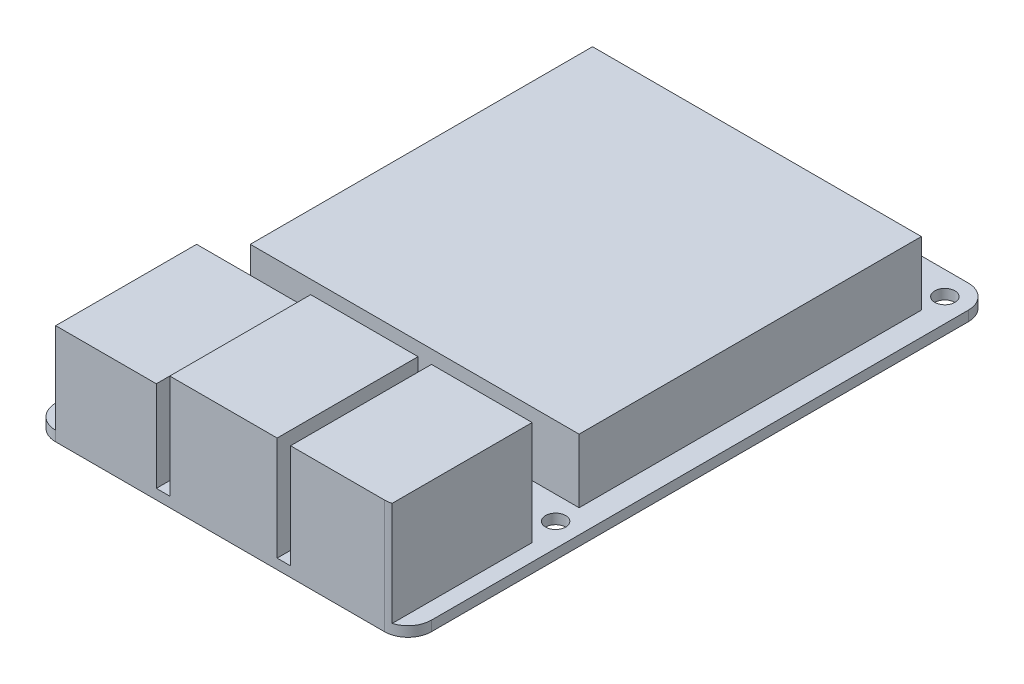
ISO-10303-21;
HEADER;
FILE_DESCRIPTION(('STEP AP214'),'2;1');
FILE_NAME('part.step','',(''),(''),'','','');
FILE_SCHEMA(('AUTOMOTIVE_DESIGN { 1 0 10303 214 1 1 1 1 }'));
ENDSEC;
DATA;
#1=APPLICATION_CONTEXT('core data for automotive mechanical design processes');
#2=APPLICATION_PROTOCOL_DEFINITION('international standard','automotive_design',2000,#1);
#3=PRODUCT_CONTEXT('',#1,'mechanical');
#4=PRODUCT('Part','Part','',(#3));
#5=PRODUCT_RELATED_PRODUCT_CATEGORY('part','',(#4));
#6=PRODUCT_DEFINITION_FORMATION('','',#4);
#7=PRODUCT_DEFINITION_CONTEXT('part definition',#1,'design');
#8=PRODUCT_DEFINITION('design','',#6,#7);
#9=PRODUCT_DEFINITION_SHAPE('','',#8);
#10=(LENGTH_UNIT() NAMED_UNIT(*) SI_UNIT(.MILLI.,.METRE.));
#11=(NAMED_UNIT(*) PLANE_ANGLE_UNIT() SI_UNIT($,.RADIAN.));
#12=(NAMED_UNIT(*) SI_UNIT($,.STERADIAN.) SOLID_ANGLE_UNIT());
#13=UNCERTAINTY_MEASURE_WITH_UNIT(LENGTH_MEASURE(1.E-05),#10,'distance_accuracy_value','');
#14=(GEOMETRIC_REPRESENTATION_CONTEXT(3) GLOBAL_UNCERTAINTY_ASSIGNED_CONTEXT((#13)) GLOBAL_UNIT_ASSIGNED_CONTEXT((#10,
#11,#12)) REPRESENTATION_CONTEXT('',''));
#15=CARTESIAN_POINT('',(0.,0.,0.));
#16=DIRECTION('',(0.,0.,1.));
#17=DIRECTION('',(1.,0.,0.));
#18=AXIS2_PLACEMENT_3D('',#15,#16,#17);
#19=CARTESIAN_POINT('',(52.5,1.5,-83.5));
#20=DIRECTION('',(0.,-1.,0.));
#21=DIRECTION('',(0.,0.,-1.));
#22=AXIS2_PLACEMENT_3D('',#19,#20,#21);
#23=PLANE('',#22);
#24=DIRECTION('',(0.,0.,-1.));
#25=VECTOR('',#24,1.);
#26=CARTESIAN_POINT('',(52.5,1.5,-29.));
#27=LINE('',#26,#25);
#28=CARTESIAN_POINT('',(52.5,1.5,-29.));
#29=VERTEX_POINT('',#28);
#30=CARTESIAN_POINT('',(52.5,1.5,-80.));
#31=VERTEX_POINT('',#30);
#32=EDGE_CURVE('E219',#29,#31,#27,.T.);
#33=ORIENTED_EDGE('',*,*,#32,.F.);
#34=DIRECTION('',(1.,0.,0.));
#35=VECTOR('',#34,1.);
#36=CARTESIAN_POINT('',(3.5,1.5,-29.));
#37=LINE('',#36,#35);
#38=CARTESIAN_POINT('',(3.5,1.5,-29.));
#39=VERTEX_POINT('',#38);
#40=EDGE_CURVE('E232',#39,#29,#37,.T.);
#41=ORIENTED_EDGE('',*,*,#40,.F.);
#42=DIRECTION('',(0.,0.,1.));
#43=VECTOR('',#42,1.);
#44=CARTESIAN_POINT('',(3.5,1.5,-80.));
#45=LINE('',#44,#43);
#46=CARTESIAN_POINT('',(3.5,1.5,-80.));
#47=VERTEX_POINT('',#46);
#48=EDGE_CURVE('E241',#47,#39,#45,.T.);
#49=ORIENTED_EDGE('',*,*,#48,.F.);
#50=DIRECTION('',(-1.,0.,0.));
#51=VECTOR('',#50,1.);
#52=CARTESIAN_POINT('',(52.5,1.5,-80.));
#53=LINE('',#52,#51);
#54=EDGE_CURVE('E222',#31,#47,#53,.T.);
#55=ORIENTED_EDGE('',*,*,#54,.F.);
#56=EDGE_LOOP('',(#33,#41,#49,#55));
#57=FACE_BOUND('',#56,.T.);
#58=CARTESIAN_POINT('',(52.5,1.5,-83.5));
#59=DIRECTION('',(0.,1.,0.));
#60=DIRECTION('',(0.,0.,1.));
#61=AXIS2_PLACEMENT_3D('',#58,#59,#60);
#62=CIRCLE('',#61,1.5);
#63=CARTESIAN_POINT('',(52.5,1.5,-82.));
#64=VERTEX_POINT('',#63);
#65=EDGE_CURVE('E411',#64,#64,#62,.T.);
#66=ORIENTED_EDGE('',*,*,#65,.F.);
#67=EDGE_LOOP('',(#66));
#68=FACE_BOUND('',#67,.T.);
#69=CARTESIAN_POINT('',(3.5,1.5,-83.5));
#70=DIRECTION('',(0.,1.,0.));
#71=DIRECTION('',(0.,0.,1.));
#72=AXIS2_PLACEMENT_3D('',#69,#70,#71);
#73=CIRCLE('',#72,1.5);
#74=CARTESIAN_POINT('',(3.5,1.5,-82.));
#75=VERTEX_POINT('',#74);
#76=EDGE_CURVE('E340',#75,#75,#73,.T.);
#77=ORIENTED_EDGE('',*,*,#76,.F.);
#78=EDGE_LOOP('',(#77));
#79=FACE_BOUND('',#78,.T.);
#80=CARTESIAN_POINT('',(52.5,1.5,-25.5));
#81=DIRECTION('',(0.,1.,0.));
#82=DIRECTION('',(0.,0.,1.));
#83=AXIS2_PLACEMENT_3D('',#80,#81,#82);
#84=CIRCLE('',#83,1.5);
#85=CARTESIAN_POINT('',(52.5,1.5,-24.));
#86=VERTEX_POINT('',#85);
#87=EDGE_CURVE('E405',#86,#86,#84,.T.);
#88=ORIENTED_EDGE('',*,*,#87,.F.);
#89=EDGE_LOOP('',(#88));
#90=FACE_BOUND('',#89,.T.);
#91=CARTESIAN_POINT('',(3.5,1.5,-25.5));
#92=DIRECTION('',(0.,1.,0.));
#93=DIRECTION('',(0.,0.,1.));
#94=AXIS2_PLACEMENT_3D('',#91,#92,#93);
#95=CIRCLE('',#94,1.5);
#96=CARTESIAN_POINT('',(3.5,1.5,-24.));
#97=VERTEX_POINT('',#96);
#98=EDGE_CURVE('E417',#97,#97,#95,.T.);
#99=ORIENTED_EDGE('',*,*,#98,.F.);
#100=EDGE_LOOP('',(#99));
#101=FACE_BOUND('',#100,.T.);
#102=DIRECTION('',(0.,0.,-1.));
#103=VECTOR('',#102,1.);
#104=CARTESIAN_POINT('',(18.5,1.5,0.));
#105=LINE('',#104,#103);
#106=CARTESIAN_POINT('',(18.5,1.5,0.));
#107=VERTEX_POINT('',#106);
#108=CARTESIAN_POINT('',(18.5,1.5,-21.));
#109=VERTEX_POINT('',#108);
#110=EDGE_CURVE('E218',#107,#109,#105,.T.);
#111=ORIENTED_EDGE('',*,*,#110,.F.);
#112=DIRECTION('',(1.,0.,0.));
#113=VECTOR('',#112,1.);
#114=CARTESIAN_POINT('',(3.50000000000002,1.5,0.));
#115=LINE('',#114,#113);
#116=CARTESIAN_POINT('',(20.5,1.5,0.));
#117=VERTEX_POINT('',#116);
#118=EDGE_CURVE('E41',#107,#117,#115,.T.);
#119=ORIENTED_EDGE('',*,*,#118,.T.);
#120=DIRECTION('',(0.,0.,-1.));
#121=VECTOR('',#120,1.);
#122=CARTESIAN_POINT('',(20.5,1.5,0.));
#123=LINE('',#122,#121);
#124=CARTESIAN_POINT('',(20.5,1.5,-21.));
#125=VERTEX_POINT('',#124);
#126=EDGE_CURVE('E295',#117,#125,#123,.T.);
#127=ORIENTED_EDGE('',*,*,#126,.T.);
#128=DIRECTION('',(1.,0.,0.));
#129=VECTOR('',#128,1.);
#130=CARTESIAN_POINT('',(0.,1.5,-21.));
#131=LINE('',#130,#129);
#132=CARTESIAN_POINT('',(36.5,1.5,-21.));
#133=VERTEX_POINT('',#132);
#134=EDGE_CURVE('E306',#125,#133,#131,.T.);
#135=ORIENTED_EDGE('',*,*,#134,.T.);
#136=DIRECTION('',(0.,0.,1.));
#137=VECTOR('',#136,1.);
#138=CARTESIAN_POINT('',(36.5,1.5,0.));
#139=LINE('',#138,#137);
#140=CARTESIAN_POINT('',(36.5,1.5,0.));
#141=VERTEX_POINT('',#140);
#142=EDGE_CURVE('E290',#133,#141,#139,.T.);
#143=ORIENTED_EDGE('',*,*,#142,.T.);
#144=CARTESIAN_POINT('',(38.5,1.5,0.));
#145=VERTEX_POINT('',#144);
#146=EDGE_CURVE('E323',#141,#145,#115,.T.);
#147=ORIENTED_EDGE('',*,*,#146,.T.);
#148=DIRECTION('',(0.,0.,-1.));
#149=VECTOR('',#148,1.);
#150=CARTESIAN_POINT('',(38.5,1.5,0.));
#151=LINE('',#150,#149);
#152=CARTESIAN_POINT('',(38.5,1.5,-21.));
#153=VERTEX_POINT('',#152);
#154=EDGE_CURVE('E275',#145,#153,#151,.T.);
#155=ORIENTED_EDGE('',*,*,#154,.T.);
#156=DIRECTION('',(1.,0.,0.));
#157=VECTOR('',#156,1.);
#158=CARTESIAN_POINT('',(0.,1.5,-21.));
#159=LINE('',#158,#157);
#160=CARTESIAN_POINT('',(53.5,1.5,-21.));
#161=VERTEX_POINT('',#160);
#162=EDGE_CURVE('E257',#153,#161,#159,.T.);
#163=ORIENTED_EDGE('',*,*,#162,.T.);
#164=DIRECTION('',(0.,0.,1.));
#165=VECTOR('',#164,1.);
#166=CARTESIAN_POINT('',(53.5,1.5,0.));
#167=LINE('',#166,#165);
#168=CARTESIAN_POINT('',(53.5,1.5,-0.145898033750314));
#169=VERTEX_POINT('',#168);
#170=EDGE_CURVE('E262',#161,#169,#167,.T.);
#171=ORIENTED_EDGE('',*,*,#170,.T.);
#172=CARTESIAN_POINT('',(52.5,1.5,-3.5));
#173=DIRECTION('',(0.,1.,0.));
#174=DIRECTION('',(0.,0.,1.));
#175=AXIS2_PLACEMENT_3D('',#172,#173,#174);
#176=CIRCLE('',#175,3.5);
#177=CARTESIAN_POINT('',(56.,1.5,-3.50000000000002));
#178=VERTEX_POINT('',#177);
#179=EDGE_CURVE('E330',#169,#178,#176,.T.);
#180=ORIENTED_EDGE('',*,*,#179,.T.);
#181=DIRECTION('',(0.,0.,-1.));
#182=VECTOR('',#181,1.);
#183=CARTESIAN_POINT('',(56.,1.5,-83.5));
#184=LINE('',#183,#182);
#185=CARTESIAN_POINT('',(56.,1.5,-83.5));
#186=VERTEX_POINT('',#185);
#187=EDGE_CURVE('E333',#178,#186,#184,.T.);
#188=ORIENTED_EDGE('',*,*,#187,.T.);
#189=CARTESIAN_POINT('',(52.5,1.5,-83.5));
#190=DIRECTION('',(0.,1.,0.));
#191=DIRECTION('',(0.,0.,-1.));
#192=AXIS2_PLACEMENT_3D('',#189,#190,#191);
#193=CIRCLE('',#192,3.5);
#194=CARTESIAN_POINT('',(52.5,1.5,-87.));
#195=VERTEX_POINT('',#194);
#196=EDGE_CURVE('E354',#186,#195,#193,.T.);
#197=ORIENTED_EDGE('',*,*,#196,.T.);
#198=DIRECTION('',(-1.,0.,0.));
#199=VECTOR('',#198,1.);
#200=CARTESIAN_POINT('',(3.50000000000002,1.5,-87.));
#201=LINE('',#200,#199);
#202=CARTESIAN_POINT('',(3.50000000000002,1.5,-87.));
#203=VERTEX_POINT('',#202);
#204=EDGE_CURVE('E396',#195,#203,#201,.T.);
#205=ORIENTED_EDGE('',*,*,#204,.T.);
#206=CARTESIAN_POINT('',(3.5,1.5,-83.5));
#207=DIRECTION('',(0.,1.,0.));
#208=DIRECTION('',(0.,0.,-1.));
#209=AXIS2_PLACEMENT_3D('',#206,#207,#208);
#210=CIRCLE('',#209,3.5);
#211=CARTESIAN_POINT('',(0.,1.5,-83.5));
#212=VERTEX_POINT('',#211);
#213=EDGE_CURVE('E378',#203,#212,#210,.T.);
#214=ORIENTED_EDGE('',*,*,#213,.T.);
#215=DIRECTION('',(0.,0.,1.));
#216=VECTOR('',#215,1.);
#217=CARTESIAN_POINT('',(0.,1.5,-3.50000000000002));
#218=LINE('',#217,#216);
#219=CARTESIAN_POINT('',(0.,1.5,-3.50000000000002));
#220=VERTEX_POINT('',#219);
#221=EDGE_CURVE('E395',#212,#220,#218,.T.);
#222=ORIENTED_EDGE('',*,*,#221,.T.);
#223=CARTESIAN_POINT('',(3.5,1.5,-3.5));
#224=DIRECTION('',(0.,1.,0.));
#225=DIRECTION('',(0.,0.,-1.));
#226=AXIS2_PLACEMENT_3D('',#223,#224,#225);
#227=CIRCLE('',#226,3.5);
#228=CARTESIAN_POINT('',(3.50000000000002,1.5,0.));
#229=VERTEX_POINT('',#228);
#230=EDGE_CURVE('E324',#220,#229,#227,.T.);
#231=ORIENTED_EDGE('',*,*,#230,.T.);
#232=DIRECTION('',(0.,0.,1.));
#233=VECTOR('',#232,1.);
#234=CARTESIAN_POINT('',(3.50000000000002,1.5,0.));
#235=LINE('',#234,#233);
#236=CARTESIAN_POINT('',(3.50000000000001,1.5,-21.));
#237=VERTEX_POINT('',#236);
#238=EDGE_CURVE('E60',#237,#229,#235,.T.);
#239=ORIENTED_EDGE('',*,*,#238,.F.);
#240=DIRECTION('',(-1.,0.,0.));
#241=VECTOR('',#240,1.);
#242=CARTESIAN_POINT('',(0.,1.5,-21.));
#243=LINE('',#242,#241);
#244=EDGE_CURVE('E55',#109,#237,#243,.T.);
#245=ORIENTED_EDGE('',*,*,#244,.F.);
#246=EDGE_LOOP('',(#111,#119,#127,#135,#143,#147,#155,#163,#171,#180,#188,#197,#205,#214,#222,
#231,#239,#245));
#247=FACE_BOUND('',#246,.T.);
#248=ADVANCED_FACE('F37',(#57,#68,#79,#90,#101,#247),#23,.F.);
#249=CARTESIAN_POINT('',(52.5,0.,-83.5));
#250=DIRECTION('',(0.,-1.,0.));
#251=DIRECTION('',(0.,0.,-1.));
#252=AXIS2_PLACEMENT_3D('',#249,#250,#251);
#253=PLANE('',#252);
#254=CARTESIAN_POINT('',(52.5,0.,-83.5));
#255=DIRECTION('',(0.,1.,0.));
#256=DIRECTION('',(0.,0.,1.));
#257=AXIS2_PLACEMENT_3D('',#254,#255,#256);
#258=CIRCLE('',#257,1.5);
#259=CARTESIAN_POINT('',(52.5,0.,-82.));
#260=VERTEX_POINT('',#259);
#261=EDGE_CURVE('E414',#260,#260,#258,.T.);
#262=ORIENTED_EDGE('',*,*,#261,.T.);
#263=EDGE_LOOP('',(#262));
#264=FACE_BOUND('',#263,.T.);
#265=CARTESIAN_POINT('',(3.5,0.,-83.5));
#266=DIRECTION('',(0.,1.,0.));
#267=DIRECTION('',(0.,0.,1.));
#268=AXIS2_PLACEMENT_3D('',#265,#266,#267);
#269=CIRCLE('',#268,1.5);
#270=CARTESIAN_POINT('',(3.5,0.,-82.));
#271=VERTEX_POINT('',#270);
#272=EDGE_CURVE('E402',#271,#271,#269,.T.);
#273=ORIENTED_EDGE('',*,*,#272,.T.);
#274=EDGE_LOOP('',(#273));
#275=FACE_BOUND('',#274,.T.);
#276=CARTESIAN_POINT('',(52.5,0.,-83.5));
#277=DIRECTION('',(0.,1.,0.));
#278=DIRECTION('',(0.,0.,-1.));
#279=AXIS2_PLACEMENT_3D('',#276,#277,#278);
#280=CIRCLE('',#279,3.5);
#281=CARTESIAN_POINT('',(56.,0.,-83.5));
#282=VERTEX_POINT('',#281);
#283=CARTESIAN_POINT('',(52.5,0.,-87.));
#284=VERTEX_POINT('',#283);
#285=EDGE_CURVE('E336',#282,#284,#280,.T.);
#286=ORIENTED_EDGE('',*,*,#285,.F.);
#287=DIRECTION('',(0.,0.,-1.));
#288=VECTOR('',#287,1.);
#289=CARTESIAN_POINT('',(56.,0.,-83.5));
#290=LINE('',#289,#288);
#291=CARTESIAN_POINT('',(56.,0.,-3.50000000000002));
#292=VERTEX_POINT('',#291);
#293=EDGE_CURVE('E352',#292,#282,#290,.T.);
#294=ORIENTED_EDGE('',*,*,#293,.F.);
#295=CARTESIAN_POINT('',(52.5,0.,-3.5));
#296=DIRECTION('',(0.,1.,0.));
#297=DIRECTION('',(0.,0.,1.));
#298=AXIS2_PLACEMENT_3D('',#295,#296,#297);
#299=CIRCLE('',#298,3.5);
#300=CARTESIAN_POINT('',(52.5,0.,0.));
#301=VERTEX_POINT('',#300);
#302=EDGE_CURVE('E350',#301,#292,#299,.T.);
#303=ORIENTED_EDGE('',*,*,#302,.F.);
#304=DIRECTION('',(1.,0.,0.));
#305=VECTOR('',#304,1.);
#306=CARTESIAN_POINT('',(3.50000000000002,0.,0.));
#307=LINE('',#306,#305);
#308=CARTESIAN_POINT('',(3.50000000000002,0.,0.));
#309=VERTEX_POINT('',#308);
#310=EDGE_CURVE('E348',#309,#301,#307,.T.);
#311=ORIENTED_EDGE('',*,*,#310,.F.);
#312=CARTESIAN_POINT('',(3.5,0.,-3.5));
#313=DIRECTION('',(0.,1.,0.));
#314=DIRECTION('',(0.,0.,-1.));
#315=AXIS2_PLACEMENT_3D('',#312,#313,#314);
#316=CIRCLE('',#315,3.5);
#317=CARTESIAN_POINT('',(0.,0.,-3.50000000000002));
#318=VERTEX_POINT('',#317);
#319=EDGE_CURVE('E346',#318,#309,#316,.T.);
#320=ORIENTED_EDGE('',*,*,#319,.F.);
#321=DIRECTION('',(0.,0.,1.));
#322=VECTOR('',#321,1.);
#323=CARTESIAN_POINT('',(0.,0.,-3.50000000000002));
#324=LINE('',#323,#322);
#325=CARTESIAN_POINT('',(0.,0.,-83.5));
#326=VERTEX_POINT('',#325);
#327=EDGE_CURVE('E344',#326,#318,#324,.T.);
#328=ORIENTED_EDGE('',*,*,#327,.F.);
#329=CARTESIAN_POINT('',(3.5,0.,-83.5));
#330=DIRECTION('',(0.,1.,0.));
#331=DIRECTION('',(0.,0.,-1.));
#332=AXIS2_PLACEMENT_3D('',#329,#330,#331);
#333=CIRCLE('',#332,3.5);
#334=CARTESIAN_POINT('',(3.50000000000002,0.,-87.));
#335=VERTEX_POINT('',#334);
#336=EDGE_CURVE('E342',#335,#326,#333,.T.);
#337=ORIENTED_EDGE('',*,*,#336,.F.);
#338=DIRECTION('',(-1.,0.,0.));
#339=VECTOR('',#338,1.);
#340=CARTESIAN_POINT('',(3.50000000000002,0.,-87.));
#341=LINE('',#340,#339);
#342=EDGE_CURVE('E339',#284,#335,#341,.T.);
#343=ORIENTED_EDGE('',*,*,#342,.F.);
#344=EDGE_LOOP('',(#286,#294,#303,#311,#320,#328,#337,#343));
#345=FACE_BOUND('',#344,.T.);
#346=CARTESIAN_POINT('',(52.5,0.,-25.5));
#347=DIRECTION('',(0.,1.,0.));
#348=DIRECTION('',(0.,0.,1.));
#349=AXIS2_PLACEMENT_3D('',#346,#347,#348);
#350=CIRCLE('',#349,1.5);
#351=CARTESIAN_POINT('',(52.5,0.,-24.));
#352=VERTEX_POINT('',#351);
#353=EDGE_CURVE('E408',#352,#352,#350,.T.);
#354=ORIENTED_EDGE('',*,*,#353,.T.);
#355=EDGE_LOOP('',(#354));
#356=FACE_BOUND('',#355,.T.);
#357=CARTESIAN_POINT('',(3.5,0.,-25.5));
#358=DIRECTION('',(0.,1.,0.));
#359=DIRECTION('',(0.,0.,1.));
#360=AXIS2_PLACEMENT_3D('',#357,#358,#359);
#361=CIRCLE('',#360,1.5);
#362=CARTESIAN_POINT('',(3.5,0.,-24.));
#363=VERTEX_POINT('',#362);
#364=EDGE_CURVE('E420',#363,#363,#361,.T.);
#365=ORIENTED_EDGE('',*,*,#364,.T.);
#366=EDGE_LOOP('',(#365));
#367=FACE_BOUND('',#366,.T.);
#368=ADVANCED_FACE('F383',(#264,#275,#345,#356,#367),#253,.T.);
#369=CARTESIAN_POINT('',(52.5,1.5,-83.5));
#370=DIRECTION('',(0.,-1.,0.));
#371=DIRECTION('',(0.,0.,-1.));
#372=AXIS2_PLACEMENT_3D('',#369,#370,#371);
#373=CYLINDRICAL_SURFACE('',#372,3.5);
#374=ORIENTED_EDGE('',*,*,#285,.T.);
#375=DIRECTION('',(0.,-1.,0.));
#376=VECTOR('',#375,1.);
#377=CARTESIAN_POINT('',(52.5,1.5,-87.));
#378=LINE('',#377,#376);
#379=EDGE_CURVE('E11',#195,#284,#378,.T.);
#380=ORIENTED_EDGE('',*,*,#379,.F.);
#381=ORIENTED_EDGE('',*,*,#196,.F.);
#382=DIRECTION('',(0.,-1.,0.));
#383=VECTOR('',#382,1.);
#384=CARTESIAN_POINT('',(56.,1.5,-83.5));
#385=LINE('',#384,#383);
#386=EDGE_CURVE('E335',#186,#282,#385,.T.);
#387=ORIENTED_EDGE('',*,*,#386,.T.);
#388=EDGE_LOOP('',(#374,#380,#381,#387));
#389=FACE_BOUND('',#388,.T.);
#390=ADVANCED_FACE('F39',(#389),#373,.T.);
#391=CARTESIAN_POINT('',(3.50000000000002,1.5,-87.));
#392=DIRECTION('',(0.,0.,1.));
#393=DIRECTION('',(1.,0.,0.));
#394=AXIS2_PLACEMENT_3D('',#391,#392,#393);
#395=PLANE('',#394);
#396=ORIENTED_EDGE('',*,*,#342,.T.);
#397=DIRECTION('',(0.,-1.,0.));
#398=VECTOR('',#397,1.);
#399=CARTESIAN_POINT('',(3.50000000000002,1.5,-87.));
#400=LINE('',#399,#398);
#401=EDGE_CURVE('E47',#203,#335,#400,.T.);
#402=ORIENTED_EDGE('',*,*,#401,.F.);
#403=ORIENTED_EDGE('',*,*,#204,.F.);
#404=ORIENTED_EDGE('',*,*,#379,.T.);
#405=EDGE_LOOP('',(#396,#402,#403,#404));
#406=FACE_BOUND('',#405,.T.);
#407=ADVANCED_FACE('F472',(#406),#395,.F.);
#408=CARTESIAN_POINT('',(3.5,1.5,-83.5));
#409=DIRECTION('',(0.,-1.,0.));
#410=DIRECTION('',(0.,0.,-1.));
#411=AXIS2_PLACEMENT_3D('',#408,#409,#410);
#412=CYLINDRICAL_SURFACE('',#411,3.5);
#413=ORIENTED_EDGE('',*,*,#336,.T.);
#414=DIRECTION('',(0.,-1.,0.));
#415=VECTOR('',#414,1.);
#416=CARTESIAN_POINT('',(0.,1.5,-83.5));
#417=LINE('',#416,#415);
#418=EDGE_CURVE('E369',#212,#326,#417,.T.);
#419=ORIENTED_EDGE('',*,*,#418,.F.);
#420=ORIENTED_EDGE('',*,*,#213,.F.);
#421=ORIENTED_EDGE('',*,*,#401,.T.);
#422=EDGE_LOOP('',(#413,#419,#420,#421));
#423=FACE_BOUND('',#422,.T.);
#424=ADVANCED_FACE('F376',(#423),#412,.T.);
#425=CARTESIAN_POINT('',(0.,1.5,-3.50000000000002));
#426=DIRECTION('',(1.,0.,0.));
#427=DIRECTION('',(0.,0.,-1.));
#428=AXIS2_PLACEMENT_3D('',#425,#426,#427);
#429=PLANE('',#428);
#430=ORIENTED_EDGE('',*,*,#327,.T.);
#431=DIRECTION('',(0.,-1.,0.));
#432=VECTOR('',#431,1.);
#433=CARTESIAN_POINT('',(0.,1.5,-3.50000000000002));
#434=LINE('',#433,#432);
#435=EDGE_CURVE('E366',#220,#318,#434,.T.);
#436=ORIENTED_EDGE('',*,*,#435,.F.);
#437=ORIENTED_EDGE('',*,*,#221,.F.);
#438=ORIENTED_EDGE('',*,*,#418,.T.);
#439=EDGE_LOOP('',(#430,#436,#437,#438));
#440=FACE_BOUND('',#439,.T.);
#441=ADVANCED_FACE('F389',(#440),#429,.F.);
#442=CARTESIAN_POINT('',(3.5,1.5,-3.5));
#443=DIRECTION('',(0.,-1.,0.));
#444=DIRECTION('',(0.,0.,-1.));
#445=AXIS2_PLACEMENT_3D('',#442,#443,#444);
#446=CYLINDRICAL_SURFACE('',#445,3.5);
#447=ORIENTED_EDGE('',*,*,#319,.T.);
#448=DIRECTION('',(0.,-1.,0.));
#449=VECTOR('',#448,1.);
#450=CARTESIAN_POINT('',(3.50000000000002,1.5,0.));
#451=LINE('',#450,#449);
#452=EDGE_CURVE('E363',#229,#309,#451,.T.);
#453=ORIENTED_EDGE('',*,*,#452,.F.);
#454=ORIENTED_EDGE('',*,*,#230,.F.);
#455=ORIENTED_EDGE('',*,*,#435,.T.);
#456=EDGE_LOOP('',(#447,#453,#454,#455));
#457=FACE_BOUND('',#456,.T.);
#458=ADVANCED_FACE('F393',(#457),#446,.T.);
#459=CARTESIAN_POINT('',(3.50000000000002,1.5,0.));
#460=DIRECTION('',(0.,0.,-1.));
#461=DIRECTION('',(-1.,0.,0.));
#462=AXIS2_PLACEMENT_3D('',#459,#460,#461);
#463=PLANE('',#462);
#464=ORIENTED_EDGE('',*,*,#310,.T.);
#465=DIRECTION('',(0.,-1.,0.));
#466=VECTOR('',#465,1.);
#467=CARTESIAN_POINT('',(52.5,1.5,0.));
#468=LINE('',#467,#466);
#469=CARTESIAN_POINT('',(52.5,17.,0.));
#470=VERTEX_POINT('',#469);
#471=EDGE_CURVE('E360',#470,#301,#468,.T.);
#472=ORIENTED_EDGE('',*,*,#471,.F.);
#473=DIRECTION('',(1.,0.,0.));
#474=VECTOR('',#473,1.);
#475=CARTESIAN_POINT('',(0.,17.,0.));
#476=LINE('',#475,#474);
#477=CARTESIAN_POINT('',(38.5,17.,0.));
#478=VERTEX_POINT('',#477);
#479=EDGE_CURVE('E265',#478,#470,#476,.T.);
#480=ORIENTED_EDGE('',*,*,#479,.F.);
#481=DIRECTION('',(0.,-1.,0.));
#482=VECTOR('',#481,1.);
#483=CARTESIAN_POINT('',(38.5,17.,0.));
#484=LINE('',#483,#482);
#485=EDGE_CURVE('E284',#478,#145,#484,.T.);
#486=ORIENTED_EDGE('',*,*,#485,.T.);
#487=ORIENTED_EDGE('',*,*,#146,.F.);
#488=DIRECTION('',(0.,-1.,0.));
#489=VECTOR('',#488,1.);
#490=CARTESIAN_POINT('',(36.5,17.,0.));
#491=LINE('',#490,#489);
#492=CARTESIAN_POINT('',(36.5,17.,0.));
#493=VERTEX_POINT('',#492);
#494=EDGE_CURVE('E303',#493,#141,#491,.T.);
#495=ORIENTED_EDGE('',*,*,#494,.F.);
#496=DIRECTION('',(1.,0.,0.));
#497=VECTOR('',#496,1.);
#498=CARTESIAN_POINT('',(0.,17.,0.));
#499=LINE('',#498,#497);
#500=CARTESIAN_POINT('',(20.5,17.,0.));
#501=VERTEX_POINT('',#500);
#502=EDGE_CURVE('E301',#501,#493,#499,.T.);
#503=ORIENTED_EDGE('',*,*,#502,.F.);
#504=DIRECTION('',(0.,-1.,0.));
#505=VECTOR('',#504,1.);
#506=CARTESIAN_POINT('',(20.5,17.,0.));
#507=LINE('',#506,#505);
#508=EDGE_CURVE('E313',#501,#117,#507,.T.);
#509=ORIENTED_EDGE('',*,*,#508,.T.);
#510=ORIENTED_EDGE('',*,*,#118,.F.);
#511=DIRECTION('',(0.,-1.,0.));
#512=VECTOR('',#511,1.);
#513=CARTESIAN_POINT('',(18.5,15.,0.));
#514=LINE('',#513,#512);
#515=CARTESIAN_POINT('',(18.5,15.,0.));
#516=VERTEX_POINT('',#515);
#517=EDGE_CURVE('E774',#516,#107,#514,.T.);
#518=ORIENTED_EDGE('',*,*,#517,.F.);
#519=DIRECTION('',(1.,0.,0.));
#520=VECTOR('',#519,1.);
#521=CARTESIAN_POINT('',(0.,15.,0.));
#522=LINE('',#521,#520);
#523=CARTESIAN_POINT('',(3.50000000000002,15.,0.));
#524=VERTEX_POINT('',#523);
#525=EDGE_CURVE('E212',#524,#516,#522,.T.);
#526=ORIENTED_EDGE('',*,*,#525,.F.);
#527=DIRECTION('',(0.,-1.,0.));
#528=VECTOR('',#527,1.);
#529=CARTESIAN_POINT('',(3.50000000000002,15.,0.));
#530=LINE('',#529,#528);
#531=EDGE_CURVE('E224',#524,#229,#530,.T.);
#532=ORIENTED_EDGE('',*,*,#531,.T.);
#533=ORIENTED_EDGE('',*,*,#452,.T.);
#534=EDGE_LOOP('',(#464,#472,#480,#486,#487,#495,#503,#509,#510,#518,#526,#532,#533));
#535=FACE_BOUND('',#534,.T.);
#536=ADVANCED_FACE('F438',(#535),#463,.F.);
#537=CARTESIAN_POINT('',(52.5,1.5,-3.5));
#538=DIRECTION('',(0.,-1.,0.));
#539=DIRECTION('',(0.,0.,-1.));
#540=AXIS2_PLACEMENT_3D('',#537,#538,#539);
#541=CYLINDRICAL_SURFACE('',#540,3.5);
#542=ORIENTED_EDGE('',*,*,#302,.T.);
#543=DIRECTION('',(0.,-1.,0.));
#544=VECTOR('',#543,1.);
#545=CARTESIAN_POINT('',(56.,1.5,-3.50000000000002));
#546=LINE('',#545,#544);
#547=EDGE_CURVE('E357',#178,#292,#546,.T.);
#548=ORIENTED_EDGE('',*,*,#547,.F.);
#549=ORIENTED_EDGE('',*,*,#179,.F.);
#550=DIRECTION('',(0.,-1.,0.));
#551=VECTOR('',#550,1.);
#552=CARTESIAN_POINT('',(53.5,17.,-0.145898033750314));
#553=LINE('',#552,#551);
#554=CARTESIAN_POINT('',(53.5,17.,-0.145898033750314));
#555=VERTEX_POINT('',#554);
#556=EDGE_CURVE('E281',#555,#169,#553,.T.);
#557=ORIENTED_EDGE('',*,*,#556,.F.);
#558=CARTESIAN_POINT('',(52.5,17.,-3.5));
#559=DIRECTION('',(0.,1.,0.));
#560=DIRECTION('',(0.,0.,1.));
#561=AXIS2_PLACEMENT_3D('',#558,#559,#560);
#562=CIRCLE('',#561,3.5);
#563=EDGE_CURVE('E268',#470,#555,#562,.T.);
#564=ORIENTED_EDGE('',*,*,#563,.F.);
#565=ORIENTED_EDGE('',*,*,#471,.T.);
#566=EDGE_LOOP('',(#542,#548,#549,#557,#564,#565));
#567=FACE_BOUND('',#566,.T.);
#568=ADVANCED_FACE('F462',(#567),#541,.T.);
#569=CARTESIAN_POINT('',(56.,1.5,-83.5));
#570=DIRECTION('',(-1.,0.,0.));
#571=DIRECTION('',(0.,0.,1.));
#572=AXIS2_PLACEMENT_3D('',#569,#570,#571);
#573=PLANE('',#572);
#574=ORIENTED_EDGE('',*,*,#293,.T.);
#575=ORIENTED_EDGE('',*,*,#386,.F.);
#576=ORIENTED_EDGE('',*,*,#187,.F.);
#577=ORIENTED_EDGE('',*,*,#547,.T.);
#578=EDGE_LOOP('',(#574,#575,#576,#577));
#579=FACE_BOUND('',#578,.T.);
#580=ADVANCED_FACE('F469',(#579),#573,.F.);
#581=CARTESIAN_POINT('',(3.5,1.5,-83.5));
#582=DIRECTION('',(0.,-1.,0.));
#583=DIRECTION('',(0.,0.,-1.));
#584=AXIS2_PLACEMENT_3D('',#581,#582,#583);
#585=CYLINDRICAL_SURFACE('',#584,1.5);
#586=ORIENTED_EDGE('',*,*,#76,.T.);
#587=EDGE_LOOP('',(#586));
#588=FACE_BOUND('',#587,.T.);
#589=ORIENTED_EDGE('',*,*,#272,.F.);
#590=EDGE_LOOP('',(#589));
#591=FACE_BOUND('',#590,.T.);
#592=ADVANCED_FACE('F489',(#588,#591),#585,.F.);
#593=CARTESIAN_POINT('',(52.5,1.5,-25.5));
#594=DIRECTION('',(0.,-1.,0.));
#595=DIRECTION('',(0.,0.,-1.));
#596=AXIS2_PLACEMENT_3D('',#593,#594,#595);
#597=CYLINDRICAL_SURFACE('',#596,1.5);
#598=ORIENTED_EDGE('',*,*,#87,.T.);
#599=EDGE_LOOP('',(#598));
#600=FACE_BOUND('',#599,.T.);
#601=ORIENTED_EDGE('',*,*,#353,.F.);
#602=EDGE_LOOP('',(#601));
#603=FACE_BOUND('',#602,.T.);
#604=ADVANCED_FACE('F530',(#600,#603),#597,.F.);
#605=CARTESIAN_POINT('',(52.5,1.5,-83.5));
#606=DIRECTION('',(0.,-1.,0.));
#607=DIRECTION('',(0.,0.,-1.));
#608=AXIS2_PLACEMENT_3D('',#605,#606,#607);
#609=CYLINDRICAL_SURFACE('',#608,1.5);
#610=ORIENTED_EDGE('',*,*,#65,.T.);
#611=EDGE_LOOP('',(#610));
#612=FACE_BOUND('',#611,.T.);
#613=ORIENTED_EDGE('',*,*,#261,.F.);
#614=EDGE_LOOP('',(#613));
#615=FACE_BOUND('',#614,.T.);
#616=ADVANCED_FACE('F537',(#612,#615),#609,.F.);
#617=CARTESIAN_POINT('',(3.5,1.5,-25.5));
#618=DIRECTION('',(0.,-1.,0.));
#619=DIRECTION('',(0.,0.,-1.));
#620=AXIS2_PLACEMENT_3D('',#617,#618,#619);
#621=CYLINDRICAL_SURFACE('',#620,1.5);
#622=ORIENTED_EDGE('',*,*,#98,.T.);
#623=EDGE_LOOP('',(#622));
#624=FACE_BOUND('',#623,.T.);
#625=ORIENTED_EDGE('',*,*,#364,.F.);
#626=EDGE_LOOP('',(#625));
#627=FACE_BOUND('',#626,.T.);
#628=ADVANCED_FACE('F544',(#624,#627),#621,.F.);
#629=CARTESIAN_POINT('',(36.5,17.,0.));
#630=DIRECTION('',(1.,0.,0.));
#631=DIRECTION('',(0.,0.,-1.));
#632=AXIS2_PLACEMENT_3D('',#629,#630,#631);
#633=PLANE('',#632);
#634=ORIENTED_EDGE('',*,*,#142,.F.);
#635=DIRECTION('',(0.,-1.,0.));
#636=VECTOR('',#635,1.);
#637=CARTESIAN_POINT('',(36.5,17.,-21.));
#638=LINE('',#637,#636);
#639=CARTESIAN_POINT('',(36.5,17.,-21.));
#640=VERTEX_POINT('',#639);
#641=EDGE_CURVE('E423',#640,#133,#638,.T.);
#642=ORIENTED_EDGE('',*,*,#641,.F.);
#643=DIRECTION('',(0.,0.,1.));
#644=VECTOR('',#643,1.);
#645=CARTESIAN_POINT('',(36.5,17.,0.));
#646=LINE('',#645,#644);
#647=EDGE_CURVE('E291',#640,#493,#646,.T.);
#648=ORIENTED_EDGE('',*,*,#647,.T.);
#649=ORIENTED_EDGE('',*,*,#494,.T.);
#650=EDGE_LOOP('',(#634,#642,#648,#649));
#651=FACE_BOUND('',#650,.T.);
#652=ADVANCED_FACE('F445',(#651),#633,.T.);
#653=CARTESIAN_POINT('',(0.,17.,-21.));
#654=DIRECTION('',(0.,0.,-1.));
#655=DIRECTION('',(-1.,0.,0.));
#656=AXIS2_PLACEMENT_3D('',#653,#654,#655);
#657=PLANE('',#656);
#658=ORIENTED_EDGE('',*,*,#134,.F.);
#659=DIRECTION('',(0.,-1.,0.));
#660=VECTOR('',#659,1.);
#661=CARTESIAN_POINT('',(20.5,17.,-21.));
#662=LINE('',#661,#660);
#663=CARTESIAN_POINT('',(20.5,17.,-21.));
#664=VERTEX_POINT('',#663);
#665=EDGE_CURVE('E322',#664,#125,#662,.T.);
#666=ORIENTED_EDGE('',*,*,#665,.F.);
#667=DIRECTION('',(1.,0.,0.));
#668=VECTOR('',#667,1.);
#669=CARTESIAN_POINT('',(0.,17.,-21.));
#670=LINE('',#669,#668);
#671=EDGE_CURVE('E294',#664,#640,#670,.T.);
#672=ORIENTED_EDGE('',*,*,#671,.T.);
#673=ORIENTED_EDGE('',*,*,#641,.T.);
#674=EDGE_LOOP('',(#658,#666,#672,#673));
#675=FACE_BOUND('',#674,.T.);
#676=ADVANCED_FACE('F435',(#675),#657,.T.);
#677=CARTESIAN_POINT('',(20.5,17.,0.));
#678=DIRECTION('',(-1.,0.,0.));
#679=DIRECTION('',(0.,0.,1.));
#680=AXIS2_PLACEMENT_3D('',#677,#678,#679);
#681=PLANE('',#680);
#682=ORIENTED_EDGE('',*,*,#126,.F.);
#683=ORIENTED_EDGE('',*,*,#508,.F.);
#684=DIRECTION('',(0.,0.,-1.));
#685=VECTOR('',#684,1.);
#686=CARTESIAN_POINT('',(20.5,17.,0.));
#687=LINE('',#686,#685);
#688=EDGE_CURVE('E298',#501,#664,#687,.T.);
#689=ORIENTED_EDGE('',*,*,#688,.T.);
#690=ORIENTED_EDGE('',*,*,#665,.T.);
#691=EDGE_LOOP('',(#682,#683,#689,#690));
#692=FACE_BOUND('',#691,.T.);
#693=ADVANCED_FACE('F430',(#692),#681,.T.);
#694=CARTESIAN_POINT('',(0.,17.,0.));
#695=DIRECTION('',(0.,1.,0.));
#696=DIRECTION('',(0.,0.,1.));
#697=AXIS2_PLACEMENT_3D('',#694,#695,#696);
#698=PLANE('',#697);
#699=ORIENTED_EDGE('',*,*,#647,.F.);
#700=ORIENTED_EDGE('',*,*,#671,.F.);
#701=ORIENTED_EDGE('',*,*,#688,.F.);
#702=ORIENTED_EDGE('',*,*,#502,.T.);
#703=EDGE_LOOP('',(#699,#700,#701,#702));
#704=FACE_BOUND('',#703,.T.);
#705=ADVANCED_FACE('F443',(#704),#698,.T.);
#706=CARTESIAN_POINT('',(0.,17.,-21.));
#707=DIRECTION('',(0.,0.,-1.));
#708=DIRECTION('',(-1.,0.,0.));
#709=AXIS2_PLACEMENT_3D('',#706,#707,#708);
#710=PLANE('',#709);
#711=ORIENTED_EDGE('',*,*,#162,.F.);
#712=DIRECTION('',(0.,-1.,0.));
#713=VECTOR('',#712,1.);
#714=CARTESIAN_POINT('',(38.5,17.,-21.));
#715=LINE('',#714,#713);
#716=CARTESIAN_POINT('',(38.5,17.,-21.));
#717=VERTEX_POINT('',#716);
#718=EDGE_CURVE('E287',#717,#153,#715,.T.);
#719=ORIENTED_EDGE('',*,*,#718,.F.);
#720=DIRECTION('',(1.,0.,0.));
#721=VECTOR('',#720,1.);
#722=CARTESIAN_POINT('',(0.,17.,-21.));
#723=LINE('',#722,#721);
#724=CARTESIAN_POINT('',(53.5,17.,-21.));
#725=VERTEX_POINT('',#724);
#726=EDGE_CURVE('E258',#717,#725,#723,.T.);
#727=ORIENTED_EDGE('',*,*,#726,.T.);
#728=DIRECTION('',(0.,-1.,0.));
#729=VECTOR('',#728,1.);
#730=CARTESIAN_POINT('',(53.5,17.,-21.));
#731=LINE('',#730,#729);
#732=EDGE_CURVE('E273',#725,#161,#731,.T.);
#733=ORIENTED_EDGE('',*,*,#732,.T.);
#734=EDGE_LOOP('',(#711,#719,#727,#733));
#735=FACE_BOUND('',#734,.T.);
#736=ADVANCED_FACE('F454',(#735),#710,.T.);
#737=CARTESIAN_POINT('',(38.5,17.,0.));
#738=DIRECTION('',(-1.,0.,0.));
#739=DIRECTION('',(0.,0.,1.));
#740=AXIS2_PLACEMENT_3D('',#737,#738,#739);
#741=PLANE('',#740);
#742=ORIENTED_EDGE('',*,*,#154,.F.);
#743=ORIENTED_EDGE('',*,*,#485,.F.);
#744=DIRECTION('',(0.,0.,-1.));
#745=VECTOR('',#744,1.);
#746=CARTESIAN_POINT('',(38.5,17.,0.));
#747=LINE('',#746,#745);
#748=EDGE_CURVE('E261',#478,#717,#747,.T.);
#749=ORIENTED_EDGE('',*,*,#748,.T.);
#750=ORIENTED_EDGE('',*,*,#718,.T.);
#751=EDGE_LOOP('',(#742,#743,#749,#750));
#752=FACE_BOUND('',#751,.T.);
#753=ADVANCED_FACE('F450',(#752),#741,.T.);
#754=CARTESIAN_POINT('',(53.5,17.,0.));
#755=DIRECTION('',(1.,0.,0.));
#756=DIRECTION('',(0.,0.,-1.));
#757=AXIS2_PLACEMENT_3D('',#754,#755,#756);
#758=PLANE('',#757);
#759=ORIENTED_EDGE('',*,*,#170,.F.);
#760=ORIENTED_EDGE('',*,*,#732,.F.);
#761=DIRECTION('',(0.,0.,1.));
#762=VECTOR('',#761,1.);
#763=CARTESIAN_POINT('',(53.5,17.,0.));
#764=LINE('',#763,#762);
#765=EDGE_CURVE('E270',#725,#555,#764,.T.);
#766=ORIENTED_EDGE('',*,*,#765,.T.);
#767=ORIENTED_EDGE('',*,*,#556,.T.);
#768=EDGE_LOOP('',(#759,#760,#766,#767));
#769=FACE_BOUND('',#768,.T.);
#770=ADVANCED_FACE('F458',(#769),#758,.T.);
#771=CARTESIAN_POINT('',(0.,17.,0.));
#772=DIRECTION('',(0.,1.,0.));
#773=DIRECTION('',(0.,0.,1.));
#774=AXIS2_PLACEMENT_3D('',#771,#772,#773);
#775=PLANE('',#774);
#776=ORIENTED_EDGE('',*,*,#726,.F.);
#777=ORIENTED_EDGE('',*,*,#748,.F.);
#778=ORIENTED_EDGE('',*,*,#479,.T.);
#779=ORIENTED_EDGE('',*,*,#563,.T.);
#780=ORIENTED_EDGE('',*,*,#765,.F.);
#781=EDGE_LOOP('',(#776,#777,#778,#779,#780));
#782=FACE_BOUND('',#781,.T.);
#783=ADVANCED_FACE('F593',(#782),#775,.T.);
#784=CARTESIAN_POINT('',(52.5,11.,-29.));
#785=DIRECTION('',(-1.,0.,0.));
#786=DIRECTION('',(0.,0.,1.));
#787=AXIS2_PLACEMENT_3D('',#784,#785,#786);
#788=PLANE('',#787);
#789=ORIENTED_EDGE('',*,*,#32,.T.);
#790=DIRECTION('',(0.,-1.,0.));
#791=VECTOR('',#790,1.);
#792=CARTESIAN_POINT('',(52.5,11.,-80.));
#793=LINE('',#792,#791);
#794=CARTESIAN_POINT('',(52.5,11.,-80.));
#795=VERTEX_POINT('',#794);
#796=EDGE_CURVE('E254',#795,#31,#793,.T.);
#797=ORIENTED_EDGE('',*,*,#796,.F.);
#798=DIRECTION('',(0.,0.,-1.));
#799=VECTOR('',#798,1.);
#800=CARTESIAN_POINT('',(52.5,11.,-29.));
#801=LINE('',#800,#799);
#802=CARTESIAN_POINT('',(52.5,11.,-29.));
#803=VERTEX_POINT('',#802);
#804=EDGE_CURVE('E228',#803,#795,#801,.T.);
#805=ORIENTED_EDGE('',*,*,#804,.F.);
#806=DIRECTION('',(0.,-1.,0.));
#807=VECTOR('',#806,1.);
#808=CARTESIAN_POINT('',(52.5,11.,-29.));
#809=LINE('',#808,#807);
#810=EDGE_CURVE('E237',#803,#29,#809,.T.);
#811=ORIENTED_EDGE('',*,*,#810,.T.);
#812=EDGE_LOOP('',(#789,#797,#805,#811));
#813=FACE_BOUND('',#812,.T.);
#814=ADVANCED_FACE('F600',(#813),#788,.F.);
#815=CARTESIAN_POINT('',(52.5,11.,-80.));
#816=DIRECTION('',(0.,0.,1.));
#817=DIRECTION('',(1.,0.,0.));
#818=AXIS2_PLACEMENT_3D('',#815,#816,#817);
#819=PLANE('',#818);
#820=ORIENTED_EDGE('',*,*,#54,.T.);
#821=DIRECTION('',(0.,-1.,0.));
#822=VECTOR('',#821,1.);
#823=CARTESIAN_POINT('',(3.5,11.,-80.));
#824=LINE('',#823,#822);
#825=CARTESIAN_POINT('',(3.5,11.,-80.));
#826=VERTEX_POINT('',#825);
#827=EDGE_CURVE('E251',#826,#47,#824,.T.);
#828=ORIENTED_EDGE('',*,*,#827,.F.);
#829=DIRECTION('',(-1.,0.,0.));
#830=VECTOR('',#829,1.);
#831=CARTESIAN_POINT('',(52.5,11.,-80.));
#832=LINE('',#831,#830);
#833=EDGE_CURVE('E231',#795,#826,#832,.T.);
#834=ORIENTED_EDGE('',*,*,#833,.F.);
#835=ORIENTED_EDGE('',*,*,#796,.T.);
#836=EDGE_LOOP('',(#820,#828,#834,#835));
#837=FACE_BOUND('',#836,.T.);
#838=ADVANCED_FACE('F608',(#837),#819,.F.);
#839=CARTESIAN_POINT('',(3.5,11.,-80.));
#840=DIRECTION('',(1.,0.,0.));
#841=DIRECTION('',(0.,0.,-1.));
#842=AXIS2_PLACEMENT_3D('',#839,#840,#841);
#843=PLANE('',#842);
#844=ORIENTED_EDGE('',*,*,#48,.T.);
#845=DIRECTION('',(0.,-1.,0.));
#846=VECTOR('',#845,1.);
#847=CARTESIAN_POINT('',(3.5,11.,-29.));
#848=LINE('',#847,#846);
#849=CARTESIAN_POINT('',(3.5,11.,-29.));
#850=VERTEX_POINT('',#849);
#851=EDGE_CURVE('E248',#850,#39,#848,.T.);
#852=ORIENTED_EDGE('',*,*,#851,.F.);
#853=DIRECTION('',(0.,0.,1.));
#854=VECTOR('',#853,1.);
#855=CARTESIAN_POINT('',(3.5,11.,-80.));
#856=LINE('',#855,#854);
#857=EDGE_CURVE('E234',#826,#850,#856,.T.);
#858=ORIENTED_EDGE('',*,*,#857,.F.);
#859=ORIENTED_EDGE('',*,*,#827,.T.);
#860=EDGE_LOOP('',(#844,#852,#858,#859));
#861=FACE_BOUND('',#860,.T.);
#862=ADVANCED_FACE('F616',(#861),#843,.F.);
#863=CARTESIAN_POINT('',(3.5,11.,-29.));
#864=DIRECTION('',(0.,0.,-1.));
#865=DIRECTION('',(-1.,0.,0.));
#866=AXIS2_PLACEMENT_3D('',#863,#864,#865);
#867=PLANE('',#866);
#868=ORIENTED_EDGE('',*,*,#40,.T.);
#869=ORIENTED_EDGE('',*,*,#810,.F.);
#870=DIRECTION('',(1.,0.,0.));
#871=VECTOR('',#870,1.);
#872=CARTESIAN_POINT('',(3.5,11.,-29.));
#873=LINE('',#872,#871);
#874=EDGE_CURVE('E236',#850,#803,#873,.T.);
#875=ORIENTED_EDGE('',*,*,#874,.F.);
#876=ORIENTED_EDGE('',*,*,#851,.T.);
#877=EDGE_LOOP('',(#868,#869,#875,#876));
#878=FACE_BOUND('',#877,.T.);
#879=ADVANCED_FACE('F624',(#878),#867,.F.);
#880=CARTESIAN_POINT('',(0.,11.,0.));
#881=DIRECTION('',(0.,1.,0.));
#882=DIRECTION('',(0.,0.,1.));
#883=AXIS2_PLACEMENT_3D('',#880,#881,#882);
#884=PLANE('',#883);
#885=ORIENTED_EDGE('',*,*,#804,.T.);
#886=ORIENTED_EDGE('',*,*,#833,.T.);
#887=ORIENTED_EDGE('',*,*,#857,.T.);
#888=ORIENTED_EDGE('',*,*,#874,.T.);
#889=EDGE_LOOP('',(#885,#886,#887,#888));
#890=FACE_BOUND('',#889,.T.);
#891=ADVANCED_FACE('F632',(#890),#884,.T.);
#892=CARTESIAN_POINT('',(18.5,15.,0.));
#893=DIRECTION('',(-1.,0.,0.));
#894=DIRECTION('',(0.,0.,1.));
#895=AXIS2_PLACEMENT_3D('',#892,#893,#894);
#896=PLANE('',#895);
#897=ORIENTED_EDGE('',*,*,#110,.T.);
#898=DIRECTION('',(0.,-1.,0.));
#899=VECTOR('',#898,1.);
#900=CARTESIAN_POINT('',(18.5,15.,-21.));
#901=LINE('',#900,#899);
#902=CARTESIAN_POINT('',(18.5,15.,-21.));
#903=VERTEX_POINT('',#902);
#904=EDGE_CURVE('E200',#903,#109,#901,.T.);
#905=ORIENTED_EDGE('',*,*,#904,.F.);
#906=DIRECTION('',(0.,0.,-1.));
#907=VECTOR('',#906,1.);
#908=CARTESIAN_POINT('',(18.5,15.,0.));
#909=LINE('',#908,#907);
#910=EDGE_CURVE('E207',#516,#903,#909,.T.);
#911=ORIENTED_EDGE('',*,*,#910,.F.);
#912=ORIENTED_EDGE('',*,*,#517,.T.);
#913=EDGE_LOOP('',(#897,#905,#911,#912));
#914=FACE_BOUND('',#913,.T.);
#915=ADVANCED_FACE('F217',(#914),#896,.F.);
#916=CARTESIAN_POINT('',(0.,15.,-21.));
#917=DIRECTION('',(0.,0.,1.));
#918=DIRECTION('',(1.,0.,0.));
#919=AXIS2_PLACEMENT_3D('',#916,#917,#918);
#920=PLANE('',#919);
#921=ORIENTED_EDGE('',*,*,#244,.T.);
#922=DIRECTION('',(0.,-1.,0.));
#923=VECTOR('',#922,1.);
#924=CARTESIAN_POINT('',(3.50000000000001,15.,-21.));
#925=LINE('',#924,#923);
#926=CARTESIAN_POINT('',(3.50000000000001,15.,-21.));
#927=VERTEX_POINT('',#926);
#928=EDGE_CURVE('E203',#927,#237,#925,.T.);
#929=ORIENTED_EDGE('',*,*,#928,.F.);
#930=DIRECTION('',(-1.,0.,0.));
#931=VECTOR('',#930,1.);
#932=CARTESIAN_POINT('',(0.,15.,-21.));
#933=LINE('',#932,#931);
#934=EDGE_CURVE('E196',#903,#927,#933,.T.);
#935=ORIENTED_EDGE('',*,*,#934,.F.);
#936=ORIENTED_EDGE('',*,*,#904,.T.);
#937=EDGE_LOOP('',(#921,#929,#935,#936));
#938=FACE_BOUND('',#937,.T.);
#939=ADVANCED_FACE('F198',(#938),#920,.F.);
#940=CARTESIAN_POINT('',(3.50000000000002,15.,0.));
#941=DIRECTION('',(1.,0.,0.));
#942=DIRECTION('',(0.,0.,-1.));
#943=AXIS2_PLACEMENT_3D('',#940,#941,#942);
#944=PLANE('',#943);
#945=ORIENTED_EDGE('',*,*,#238,.T.);
#946=ORIENTED_EDGE('',*,*,#531,.F.);
#947=DIRECTION('',(0.,0.,1.));
#948=VECTOR('',#947,1.);
#949=CARTESIAN_POINT('',(3.50000000000002,15.,0.));
#950=LINE('',#949,#948);
#951=EDGE_CURVE('E206',#927,#524,#950,.T.);
#952=ORIENTED_EDGE('',*,*,#951,.F.);
#953=ORIENTED_EDGE('',*,*,#928,.T.);
#954=EDGE_LOOP('',(#945,#946,#952,#953));
#955=FACE_BOUND('',#954,.T.);
#956=ADVANCED_FACE('F652',(#955),#944,.F.);
#957=CARTESIAN_POINT('',(0.,15.,0.));
#958=DIRECTION('',(0.,1.,0.));
#959=DIRECTION('',(0.,0.,1.));
#960=AXIS2_PLACEMENT_3D('',#957,#958,#959);
#961=PLANE('',#960);
#962=ORIENTED_EDGE('',*,*,#910,.T.);
#963=ORIENTED_EDGE('',*,*,#934,.T.);
#964=ORIENTED_EDGE('',*,*,#951,.T.);
#965=ORIENTED_EDGE('',*,*,#525,.T.);
#966=EDGE_LOOP('',(#962,#963,#964,#965));
#967=FACE_BOUND('',#966,.T.);
#968=ADVANCED_FACE('F210',(#967),#961,.T.);
#969=CLOSED_SHELL('',(#248,#368,#390,#407,#424,#441,#458,#536,#568,#580,#592,#604,#616,#628,
#652,#676,#693,#705,#736,#753,#770,#783,#814,#838,#862,#879,#891,#915,#939,#956,#968));
#970=MANIFOLD_SOLID_BREP('B2',#969);
#971=ADVANCED_BREP_SHAPE_REPRESENTATION('',(#18,#970),#14);
#972=SHAPE_DEFINITION_REPRESENTATION(#9,#971);
ENDSEC;
END-ISO-10303-21;
